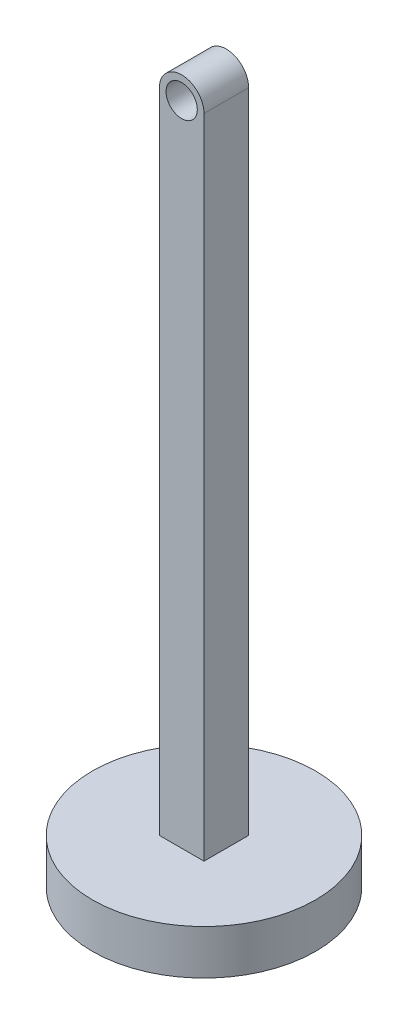
ISO-10303-21;
HEADER;
FILE_DESCRIPTION(('STEP AP214'),'2;1');
FILE_NAME('part.step','',(''),(''),'','','');
FILE_SCHEMA(('AUTOMOTIVE_DESIGN { 1 0 10303 214 1 1 1 1 }'));
ENDSEC;
DATA;
#1=APPLICATION_CONTEXT('core data for automotive mechanical design processes');
#2=APPLICATION_PROTOCOL_DEFINITION('international standard','automotive_design',2000,#1);
#3=PRODUCT_CONTEXT('',#1,'mechanical');
#4=PRODUCT('Part','Part','',(#3));
#5=PRODUCT_RELATED_PRODUCT_CATEGORY('part','',(#4));
#6=PRODUCT_DEFINITION_FORMATION('','',#4);
#7=PRODUCT_DEFINITION_CONTEXT('part definition',#1,'design');
#8=PRODUCT_DEFINITION('design','',#6,#7);
#9=PRODUCT_DEFINITION_SHAPE('','',#8);
#10=(LENGTH_UNIT() NAMED_UNIT(*) SI_UNIT(.MILLI.,.METRE.));
#11=(NAMED_UNIT(*) PLANE_ANGLE_UNIT() SI_UNIT($,.RADIAN.));
#12=(NAMED_UNIT(*) SI_UNIT($,.STERADIAN.) SOLID_ANGLE_UNIT());
#13=UNCERTAINTY_MEASURE_WITH_UNIT(LENGTH_MEASURE(1.E-05),#10,'distance_accuracy_value','');
#14=(GEOMETRIC_REPRESENTATION_CONTEXT(3) GLOBAL_UNCERTAINTY_ASSIGNED_CONTEXT((#13)) GLOBAL_UNIT_ASSIGNED_CONTEXT((#10,
#11,#12)) REPRESENTATION_CONTEXT('',''));
#15=CARTESIAN_POINT('',(0.,0.,0.));
#16=DIRECTION('',(0.,0.,1.));
#17=DIRECTION('',(1.,0.,0.));
#18=AXIS2_PLACEMENT_3D('',#15,#16,#17);
#19=CARTESIAN_POINT('',(0.,0.,10.));
#20=DIRECTION('',(0.,0.,-1.));
#21=DIRECTION('',(-1.,0.,0.));
#22=AXIS2_PLACEMENT_3D('',#19,#20,#21);
#23=PLANE('',#22);
#24=CARTESIAN_POINT('',(0.,0.,10.));
#25=DIRECTION('',(0.,0.,1.));
#26=DIRECTION('',(1.,0.,0.));
#27=AXIS2_PLACEMENT_3D('',#24,#25,#26);
#28=CIRCLE('',#27,3.5);
#29=CARTESIAN_POINT('',(3.5,0.,10.));
#30=VERTEX_POINT('',#29);
#31=EDGE_CURVE('E102',#30,#30,#28,.T.);
#32=ORIENTED_EDGE('',*,*,#31,.F.);
#33=EDGE_LOOP('',(#32));
#34=FACE_BOUND('',#33,.T.);
#35=DIRECTION('',(-1.,0.,0.));
#36=VECTOR('',#35,1.);
#37=CARTESIAN_POINT('',(0.,-145.,10.));
#38=LINE('',#37,#36);
#39=CARTESIAN_POINT('',(5.00000000000003,-145.,10.));
#40=VERTEX_POINT('',#39);
#41=CARTESIAN_POINT('',(-5.,-145.,10.));
#42=VERTEX_POINT('',#41);
#43=EDGE_CURVE('E123',#40,#42,#38,.T.);
#44=ORIENTED_EDGE('',*,*,#43,.F.);
#45=DIRECTION('',(0.,-1.,0.));
#46=VECTOR('',#45,1.);
#47=CARTESIAN_POINT('',(5.,0.,10.));
#48=LINE('',#47,#46);
#49=CARTESIAN_POINT('',(5.,0.,10.));
#50=VERTEX_POINT('',#49);
#51=EDGE_CURVE('E110',#50,#40,#48,.T.);
#52=ORIENTED_EDGE('',*,*,#51,.F.);
#53=CARTESIAN_POINT('',(0.,0.,10.));
#54=DIRECTION('',(0.,0.,-1.));
#55=DIRECTION('',(-1.,0.,0.));
#56=AXIS2_PLACEMENT_3D('',#53,#54,#55);
#57=CIRCLE('',#56,5.);
#58=CARTESIAN_POINT('',(-5.,0.,10.));
#59=VERTEX_POINT('',#58);
#60=EDGE_CURVE('E98',#59,#50,#57,.T.);
#61=ORIENTED_EDGE('',*,*,#60,.F.);
#62=DIRECTION('',(0.,-1.,0.));
#63=VECTOR('',#62,1.);
#64=CARTESIAN_POINT('',(-5.,0.,10.));
#65=LINE('',#64,#63);
#66=EDGE_CURVE('E89',#59,#42,#65,.T.);
#67=ORIENTED_EDGE('',*,*,#66,.T.);
#68=EDGE_LOOP('',(#44,#52,#61,#67));
#69=FACE_BOUND('',#68,.T.);
#70=ADVANCED_FACE('F49',(#34,#69),#23,.F.);
#71=CARTESIAN_POINT('',(0.,0.,0.));
#72=DIRECTION('',(0.,0.,-1.));
#73=DIRECTION('',(-1.,0.,0.));
#74=AXIS2_PLACEMENT_3D('',#71,#72,#73);
#75=PLANE('',#74);
#76=CARTESIAN_POINT('',(0.,0.,0.));
#77=DIRECTION('',(0.,0.,1.));
#78=DIRECTION('',(1.,0.,0.));
#79=AXIS2_PLACEMENT_3D('',#76,#77,#78);
#80=CIRCLE('',#79,3.5);
#81=CARTESIAN_POINT('',(3.5,0.,0.));
#82=VERTEX_POINT('',#81);
#83=EDGE_CURVE('E106',#82,#82,#80,.T.);
#84=ORIENTED_EDGE('',*,*,#83,.T.);
#85=EDGE_LOOP('',(#84));
#86=FACE_BOUND('',#85,.T.);
#87=DIRECTION('',(0.,-1.,0.));
#88=VECTOR('',#87,1.);
#89=CARTESIAN_POINT('',(5.,0.,0.));
#90=LINE('',#89,#88);
#91=CARTESIAN_POINT('',(5.,0.,0.));
#92=VERTEX_POINT('',#91);
#93=CARTESIAN_POINT('',(5.00000000000003,-145.,0.));
#94=VERTEX_POINT('',#93);
#95=EDGE_CURVE('E99',#92,#94,#90,.T.);
#96=ORIENTED_EDGE('',*,*,#95,.T.);
#97=DIRECTION('',(-1.,0.,0.));
#98=VECTOR('',#97,1.);
#99=CARTESIAN_POINT('',(0.,-145.,0.));
#100=LINE('',#99,#98);
#101=CARTESIAN_POINT('',(-5.,-145.,0.));
#102=VERTEX_POINT('',#101);
#103=EDGE_CURVE('E64',#94,#102,#100,.T.);
#104=ORIENTED_EDGE('',*,*,#103,.T.);
#105=DIRECTION('',(0.,-1.,0.));
#106=VECTOR('',#105,1.);
#107=CARTESIAN_POINT('',(-5.,0.,0.));
#108=LINE('',#107,#106);
#109=CARTESIAN_POINT('',(-5.,0.,0.));
#110=VERTEX_POINT('',#109);
#111=EDGE_CURVE('E87',#110,#102,#108,.T.);
#112=ORIENTED_EDGE('',*,*,#111,.F.);
#113=CARTESIAN_POINT('',(0.,0.,0.));
#114=DIRECTION('',(0.,0.,-1.));
#115=DIRECTION('',(-1.,0.,0.));
#116=AXIS2_PLACEMENT_3D('',#113,#114,#115);
#117=CIRCLE('',#116,5.);
#118=EDGE_CURVE('E97',#110,#92,#117,.T.);
#119=ORIENTED_EDGE('',*,*,#118,.T.);
#120=EDGE_LOOP('',(#96,#104,#112,#119));
#121=FACE_BOUND('',#120,.T.);
#122=ADVANCED_FACE('F96',(#86,#121),#75,.T.);
#123=CARTESIAN_POINT('',(-5.,0.,10.));
#124=DIRECTION('',(1.,0.,0.));
#125=DIRECTION('',(0.,0.,-1.));
#126=AXIS2_PLACEMENT_3D('',#123,#124,#125);
#127=PLANE('',#126);
#128=DIRECTION('',(0.,0.,-1.));
#129=VECTOR('',#128,1.);
#130=CARTESIAN_POINT('',(-5.,-145.,10.));
#131=LINE('',#130,#129);
#132=EDGE_CURVE('E120',#42,#102,#131,.T.);
#133=ORIENTED_EDGE('',*,*,#132,.F.);
#134=ORIENTED_EDGE('',*,*,#66,.F.);
#135=DIRECTION('',(0.,0.,-1.));
#136=VECTOR('',#135,1.);
#137=CARTESIAN_POINT('',(-5.,0.,10.));
#138=LINE('',#137,#136);
#139=EDGE_CURVE('E57',#59,#110,#138,.T.);
#140=ORIENTED_EDGE('',*,*,#139,.T.);
#141=ORIENTED_EDGE('',*,*,#111,.T.);
#142=EDGE_LOOP('',(#133,#134,#140,#141));
#143=FACE_BOUND('',#142,.T.);
#144=ADVANCED_FACE('F85',(#143),#127,.F.);
#145=CARTESIAN_POINT('',(5.,0.,10.));
#146=DIRECTION('',(1.,0.,0.));
#147=DIRECTION('',(0.,1.,0.));
#148=AXIS2_PLACEMENT_3D('',#145,#146,#147);
#149=PLANE('',#148);
#150=ORIENTED_EDGE('',*,*,#51,.T.);
#151=DIRECTION('',(0.,0.,-1.));
#152=VECTOR('',#151,1.);
#153=CARTESIAN_POINT('',(5.00000000000003,-145.,10.));
#154=LINE('',#153,#152);
#155=EDGE_CURVE('E12',#40,#94,#154,.T.);
#156=ORIENTED_EDGE('',*,*,#155,.T.);
#157=ORIENTED_EDGE('',*,*,#95,.F.);
#158=DIRECTION('',(0.,0.,-1.));
#159=VECTOR('',#158,1.);
#160=CARTESIAN_POINT('',(5.,0.,10.));
#161=LINE('',#160,#159);
#162=EDGE_CURVE('E91',#50,#92,#161,.T.);
#163=ORIENTED_EDGE('',*,*,#162,.F.);
#164=EDGE_LOOP('',(#150,#156,#157,#163));
#165=FACE_BOUND('',#164,.T.);
#166=ADVANCED_FACE('F160',(#165),#149,.T.);
#167=CARTESIAN_POINT('',(0.,0.,10.));
#168=DIRECTION('',(0.,0.,-1.));
#169=DIRECTION('',(-1.,0.,0.));
#170=AXIS2_PLACEMENT_3D('',#167,#168,#169);
#171=CYLINDRICAL_SURFACE('',#170,5.);
#172=ORIENTED_EDGE('',*,*,#118,.F.);
#173=ORIENTED_EDGE('',*,*,#139,.F.);
#174=ORIENTED_EDGE('',*,*,#60,.T.);
#175=ORIENTED_EDGE('',*,*,#162,.T.);
#176=EDGE_LOOP('',(#172,#173,#174,#175));
#177=FACE_BOUND('',#176,.T.);
#178=ADVANCED_FACE('F51',(#177),#171,.T.);
#179=CARTESIAN_POINT('',(0.,0.,10.));
#180=DIRECTION('',(0.,0.,-1.));
#181=DIRECTION('',(-1.,0.,0.));
#182=AXIS2_PLACEMENT_3D('',#179,#180,#181);
#183=CYLINDRICAL_SURFACE('',#182,3.5);
#184=ORIENTED_EDGE('',*,*,#31,.T.);
#185=EDGE_LOOP('',(#184));
#186=FACE_BOUND('',#185,.T.);
#187=ORIENTED_EDGE('',*,*,#83,.F.);
#188=EDGE_LOOP('',(#187));
#189=FACE_BOUND('',#188,.T.);
#190=ADVANCED_FACE('F144',(#186,#189),#183,.F.);
#191=CARTESIAN_POINT('',(0.,-145.,5.));
#192=DIRECTION('',(0.,-1.,0.));
#193=DIRECTION('',(0.,0.,-1.));
#194=AXIS2_PLACEMENT_3D('',#191,#192,#193);
#195=PLANE('',#194);
#196=CARTESIAN_POINT('',(0.,-145.,5.));
#197=DIRECTION('',(0.,-1.,0.));
#198=DIRECTION('',(0.,0.,-1.));
#199=AXIS2_PLACEMENT_3D('',#196,#197,#198);
#200=CIRCLE('',#199,25.);
#201=CARTESIAN_POINT('',(0.,-145.,-20.));
#202=VERTEX_POINT('',#201);
#203=EDGE_CURVE('E128',#202,#202,#200,.T.);
#204=ORIENTED_EDGE('',*,*,#203,.F.);
#205=EDGE_LOOP('',(#204));
#206=FACE_BOUND('',#205,.T.);
#207=ORIENTED_EDGE('',*,*,#43,.T.);
#208=ORIENTED_EDGE('',*,*,#132,.T.);
#209=ORIENTED_EDGE('',*,*,#103,.F.);
#210=ORIENTED_EDGE('',*,*,#155,.F.);
#211=EDGE_LOOP('',(#207,#208,#209,#210));
#212=FACE_BOUND('',#211,.T.);
#213=ADVANCED_FACE('F139',(#206,#212),#195,.F.);
#214=CARTESIAN_POINT('',(0.,-155.,5.));
#215=DIRECTION('',(0.,1.,0.));
#216=DIRECTION('',(0.,0.,1.));
#217=AXIS2_PLACEMENT_3D('',#214,#215,#216);
#218=CYLINDRICAL_SURFACE('',#217,25.);
#219=CARTESIAN_POINT('',(0.,-155.,5.));
#220=DIRECTION('',(0.,-1.,0.));
#221=DIRECTION('',(0.,0.,-1.));
#222=AXIS2_PLACEMENT_3D('',#219,#220,#221);
#223=CIRCLE('',#222,25.);
#224=CARTESIAN_POINT('',(0.,-155.,-20.));
#225=VERTEX_POINT('',#224);
#226=EDGE_CURVE('E127',#225,#225,#223,.T.);
#227=ORIENTED_EDGE('',*,*,#226,.F.);
#228=EDGE_LOOP('',(#227));
#229=FACE_BOUND('',#228,.T.);
#230=ORIENTED_EDGE('',*,*,#203,.T.);
#231=EDGE_LOOP('',(#230));
#232=FACE_BOUND('',#231,.T.);
#233=ADVANCED_FACE('F136',(#229,#232),#218,.T.);
#234=CARTESIAN_POINT('',(0.,-155.,5.));
#235=DIRECTION('',(0.,-1.,0.));
#236=DIRECTION('',(0.,0.,-1.));
#237=AXIS2_PLACEMENT_3D('',#234,#235,#236);
#238=PLANE('',#237);
#239=ORIENTED_EDGE('',*,*,#226,.T.);
#240=EDGE_LOOP('',(#239));
#241=FACE_BOUND('',#240,.T.);
#242=ADVANCED_FACE('F134',(#241),#238,.T.);
#243=CLOSED_SHELL('',(#70,#122,#144,#166,#178,#190,#213,#233,#242));
#244=MANIFOLD_SOLID_BREP('B2',#243);
#245=ADVANCED_BREP_SHAPE_REPRESENTATION('',(#18,#244),#14);
#246=SHAPE_DEFINITION_REPRESENTATION(#9,#245);
ENDSEC;
END-ISO-10303-21;
